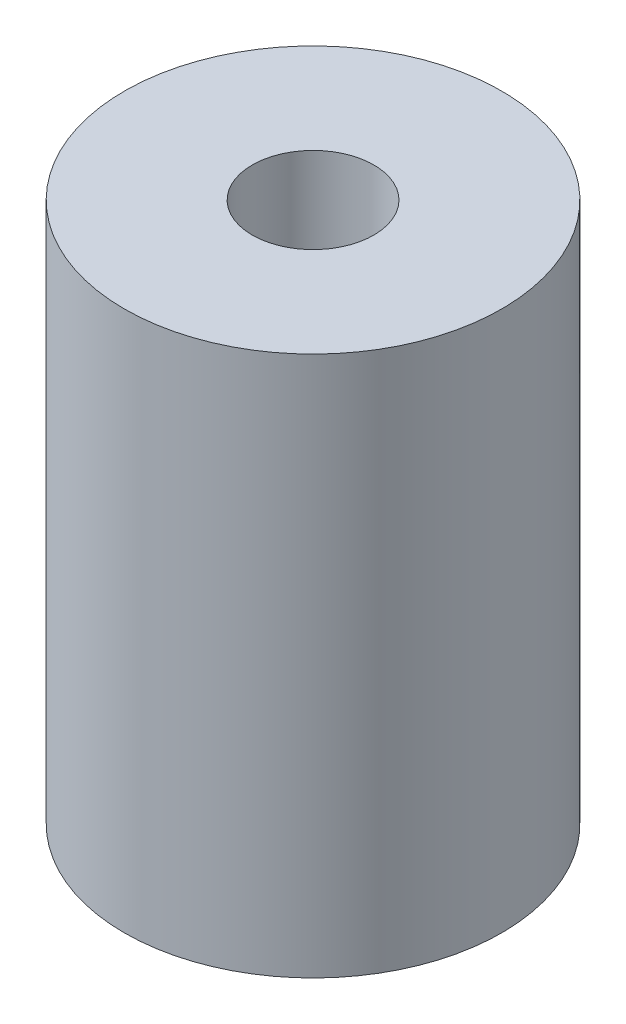
ISO-10303-21;
HEADER;
FILE_DESCRIPTION(('STEP AP214'),'2;1');
FILE_NAME('part.step','',(''),(''),'','','');
FILE_SCHEMA(('AUTOMOTIVE_DESIGN { 1 0 10303 214 1 1 1 1 }'));
ENDSEC;
DATA;
#1=APPLICATION_CONTEXT('core data for automotive mechanical design processes');
#2=APPLICATION_PROTOCOL_DEFINITION('international standard','automotive_design',2000,#1);
#3=PRODUCT_CONTEXT('',#1,'mechanical');
#4=PRODUCT('Part','Part','',(#3));
#5=PRODUCT_RELATED_PRODUCT_CATEGORY('part','',(#4));
#6=PRODUCT_DEFINITION_FORMATION('','',#4);
#7=PRODUCT_DEFINITION_CONTEXT('part definition',#1,'design');
#8=PRODUCT_DEFINITION('design','',#6,#7);
#9=PRODUCT_DEFINITION_SHAPE('','',#8);
#10=(LENGTH_UNIT() NAMED_UNIT(*) SI_UNIT(.MILLI.,.METRE.));
#11=(NAMED_UNIT(*) PLANE_ANGLE_UNIT() SI_UNIT($,.RADIAN.));
#12=(NAMED_UNIT(*) SI_UNIT($,.STERADIAN.) SOLID_ANGLE_UNIT());
#13=UNCERTAINTY_MEASURE_WITH_UNIT(LENGTH_MEASURE(1.E-05),#10,'distance_accuracy_value','');
#14=(GEOMETRIC_REPRESENTATION_CONTEXT(3) GLOBAL_UNCERTAINTY_ASSIGNED_CONTEXT((#13)) GLOBAL_UNIT_ASSIGNED_CONTEXT((#10,
#11,#12)) REPRESENTATION_CONTEXT('',''));
#15=CARTESIAN_POINT('',(0.,0.,0.));
#16=DIRECTION('',(0.,0.,1.));
#17=DIRECTION('',(1.,0.,0.));
#18=AXIS2_PLACEMENT_3D('',#15,#16,#17);
#19=CARTESIAN_POINT('',(0.,20.,0.));
#20=DIRECTION('',(0.,1.,0.));
#21=DIRECTION('',(0.,0.,1.));
#22=AXIS2_PLACEMENT_3D('',#19,#20,#21);
#23=PLANE('',#22);
#24=CARTESIAN_POINT('',(0.,20.,0.));
#25=DIRECTION('',(0.,1.,0.));
#26=DIRECTION('',(0.,0.,1.));
#27=AXIS2_PLACEMENT_3D('',#24,#25,#26);
#28=CIRCLE('',#27,6.985);
#29=CARTESIAN_POINT('',(0.,20.,6.985));
#30=VERTEX_POINT('',#29);
#31=EDGE_CURVE('E10',#30,#30,#28,.T.);
#32=ORIENTED_EDGE('',*,*,#31,.T.);
#33=EDGE_LOOP('',(#32));
#34=FACE_BOUND('',#33,.T.);
#35=CARTESIAN_POINT('',(0.,20.,0.));
#36=DIRECTION('',(0.,1.,0.));
#37=DIRECTION('',(0.,0.,1.));
#38=AXIS2_PLACEMENT_3D('',#35,#36,#37);
#39=CIRCLE('',#38,2.25);
#40=CARTESIAN_POINT('',(0.,20.,2.25));
#41=VERTEX_POINT('',#40);
#42=EDGE_CURVE('E42',#41,#41,#39,.T.);
#43=ORIENTED_EDGE('',*,*,#42,.F.);
#44=EDGE_LOOP('',(#43));
#45=FACE_BOUND('',#44,.T.);
#46=ADVANCED_FACE('F31',(#34,#45),#23,.T.);
#47=CARTESIAN_POINT('',(0.,0.,0.));
#48=DIRECTION('',(0.,1.,0.));
#49=DIRECTION('',(0.,0.,1.));
#50=AXIS2_PLACEMENT_3D('',#47,#48,#49);
#51=PLANE('',#50);
#52=CARTESIAN_POINT('',(0.,0.,0.));
#53=DIRECTION('',(0.,1.,0.));
#54=DIRECTION('',(0.,0.,1.));
#55=AXIS2_PLACEMENT_3D('',#52,#53,#54);
#56=CIRCLE('',#55,6.985);
#57=CARTESIAN_POINT('',(0.,0.,6.985));
#58=VERTEX_POINT('',#57);
#59=EDGE_CURVE('E35',#58,#58,#56,.T.);
#60=ORIENTED_EDGE('',*,*,#59,.F.);
#61=EDGE_LOOP('',(#60));
#62=FACE_BOUND('',#61,.T.);
#63=CARTESIAN_POINT('',(0.,0.,0.));
#64=DIRECTION('',(0.,1.,0.));
#65=DIRECTION('',(0.,0.,1.));
#66=AXIS2_PLACEMENT_3D('',#63,#64,#65);
#67=CIRCLE('',#66,2.25);
#68=CARTESIAN_POINT('',(0.,0.,2.25));
#69=VERTEX_POINT('',#68);
#70=EDGE_CURVE('E44',#69,#69,#67,.T.);
#71=ORIENTED_EDGE('',*,*,#70,.T.);
#72=EDGE_LOOP('',(#71));
#73=FACE_BOUND('',#72,.T.);
#74=ADVANCED_FACE('F54',(#62,#73),#51,.F.);
#75=CARTESIAN_POINT('',(0.,20.,0.));
#76=DIRECTION('',(0.,-1.,0.));
#77=DIRECTION('',(0.,0.,-1.));
#78=AXIS2_PLACEMENT_3D('',#75,#76,#77);
#79=CYLINDRICAL_SURFACE('',#78,6.985);
#80=ORIENTED_EDGE('',*,*,#31,.F.);
#81=EDGE_LOOP('',(#80));
#82=FACE_BOUND('',#81,.T.);
#83=ORIENTED_EDGE('',*,*,#59,.T.);
#84=EDGE_LOOP('',(#83));
#85=FACE_BOUND('',#84,.T.);
#86=ADVANCED_FACE('F33',(#82,#85),#79,.T.);
#87=CARTESIAN_POINT('',(0.,20.,0.));
#88=DIRECTION('',(0.,-1.,0.));
#89=DIRECTION('',(0.,0.,-1.));
#90=AXIS2_PLACEMENT_3D('',#87,#88,#89);
#91=CYLINDRICAL_SURFACE('',#90,2.25);
#92=ORIENTED_EDGE('',*,*,#42,.T.);
#93=EDGE_LOOP('',(#92));
#94=FACE_BOUND('',#93,.T.);
#95=ORIENTED_EDGE('',*,*,#70,.F.);
#96=EDGE_LOOP('',(#95));
#97=FACE_BOUND('',#96,.T.);
#98=ADVANCED_FACE('F50',(#94,#97),#91,.F.);
#99=CLOSED_SHELL('',(#46,#74,#86,#98));
#100=MANIFOLD_SOLID_BREP('B2',#99);
#101=ADVANCED_BREP_SHAPE_REPRESENTATION('',(#18,#100),#14);
#102=SHAPE_DEFINITION_REPRESENTATION(#9,#101);
ENDSEC;
END-ISO-10303-21;
